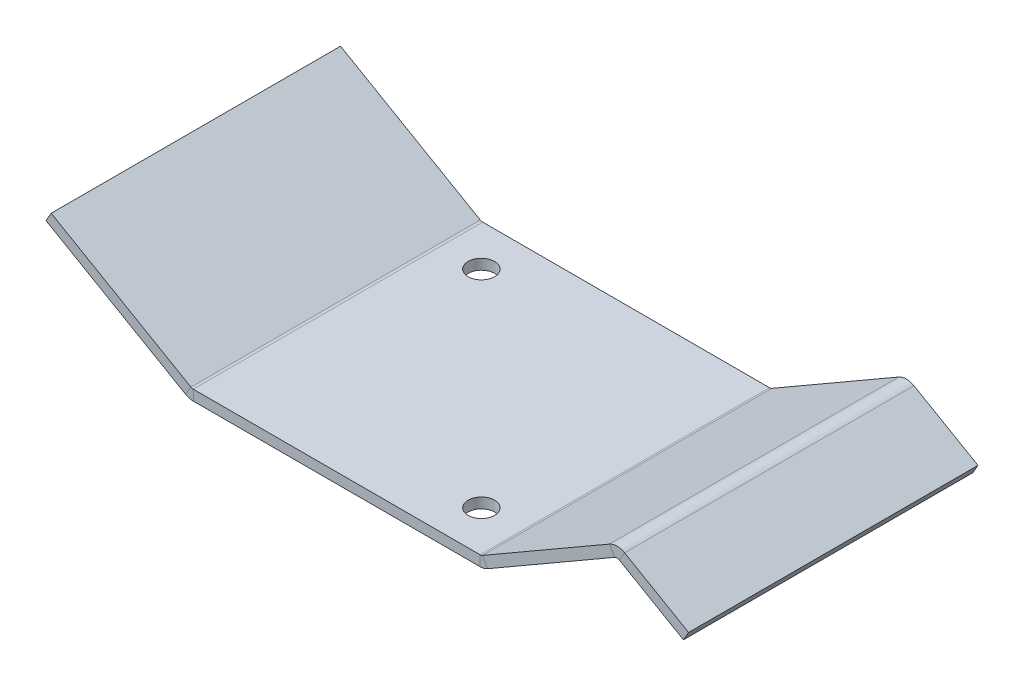
ISO-10303-21;
HEADER;
FILE_DESCRIPTION(('STEP AP214'),'2;1');
FILE_NAME('part.step','',(''),(''),'','','');
FILE_SCHEMA(('AUTOMOTIVE_DESIGN { 1 0 10303 214 1 1 1 1 }'));
ENDSEC;
DATA;
#1=APPLICATION_CONTEXT('core data for automotive mechanical design processes');
#2=APPLICATION_PROTOCOL_DEFINITION('international standard','automotive_design',2000,#1);
#3=PRODUCT_CONTEXT('',#1,'mechanical');
#4=PRODUCT('Part','Part','',(#3));
#5=PRODUCT_RELATED_PRODUCT_CATEGORY('part','',(#4));
#6=PRODUCT_DEFINITION_FORMATION('','',#4);
#7=PRODUCT_DEFINITION_CONTEXT('part definition',#1,'design');
#8=PRODUCT_DEFINITION('design','',#6,#7);
#9=PRODUCT_DEFINITION_SHAPE('','',#8);
#10=(LENGTH_UNIT() NAMED_UNIT(*) SI_UNIT(.MILLI.,.METRE.));
#11=(NAMED_UNIT(*) PLANE_ANGLE_UNIT() SI_UNIT($,.RADIAN.));
#12=(NAMED_UNIT(*) SI_UNIT($,.STERADIAN.) SOLID_ANGLE_UNIT());
#13=UNCERTAINTY_MEASURE_WITH_UNIT(LENGTH_MEASURE(1.E-05),#10,'distance_accuracy_value','');
#14=(GEOMETRIC_REPRESENTATION_CONTEXT(3) GLOBAL_UNCERTAINTY_ASSIGNED_CONTEXT((#13)) GLOBAL_UNIT_ASSIGNED_CONTEXT((#10,
#11,#12)) REPRESENTATION_CONTEXT('',''));
#15=CARTESIAN_POINT('',(0.,0.,0.));
#16=DIRECTION('',(0.,0.,1.));
#17=DIRECTION('',(1.,0.,0.));
#18=AXIS2_PLACEMENT_3D('',#15,#16,#17);
#19=CARTESIAN_POINT('',(48.41875,-1.3748153285078,-44.45));
#20=DIRECTION('',(0.,0.,1.));
#21=DIRECTION('',(1.,0.,0.));
#22=AXIS2_PLACEMENT_3D('',#19,#20,#21);
#23=PLANE('',#22);
#24=DIRECTION('',(-0.499999999999985,0.866025403784447,0.));
#25=VECTOR('',#24,1.);
#26=CARTESIAN_POINT('',(68.0916145991092,9.98331834351883,-44.45));
#27=LINE('',#26,#25);
#28=CARTESIAN_POINT('',(68.0916145991092,9.98331834351883,-44.45));
#29=VERTEX_POINT('',#28);
#30=CARTESIAN_POINT('',(67.2978645991092,11.3581336720266,-44.45));
#31=VERTEX_POINT('',#30);
#32=EDGE_CURVE('E130',#29,#31,#27,.T.);
#33=ORIENTED_EDGE('',*,*,#32,.F.);
#34=DIRECTION('',(-0.866025403784442,-0.499999999999995,0.));
#35=VECTOR('',#34,1.);
#36=CARTESIAN_POINT('',(10.3187499999997,-23.3718605846324,-44.45));
#37=LINE('',#36,#35);
#38=CARTESIAN_POINT('',(48.5896786248552,-1.27612964093542,-44.45));
#39=VERTEX_POINT('',#38);
#40=EDGE_CURVE('E417',#39,#29,#37,.F.);
#41=ORIENTED_EDGE('',*,*,#40,.F.);
#42=DIRECTION('',(-0.499999999999995,0.866025403784442,0.));
#43=VECTOR('',#42,1.);
#44=CARTESIAN_POINT('',(47.7959286248552,0.0986856875723821,-44.45));
#45=LINE('',#44,#43);
#46=CARTESIAN_POINT('',(47.7959286248552,0.0986856875723867,-44.45));
#47=VERTEX_POINT('',#46);
#48=EDGE_CURVE('E430',#47,#39,#45,.F.);
#49=ORIENTED_EDGE('',*,*,#48,.F.);
#50=DIRECTION('',(0.866025403784442,0.499999999999995,0.));
#51=VECTOR('',#50,1.);
#52=CARTESIAN_POINT('',(47.625,0.,-44.45));
#53=LINE('',#52,#51);
#54=EDGE_CURVE('E423',#47,#31,#53,.T.);
#55=ORIENTED_EDGE('',*,*,#54,.T.);
#56=EDGE_LOOP('',(#33,#41,#49,#55));
#57=FACE_BOUND('',#56,.T.);
#58=ADVANCED_FACE('F109',(#57),#23,.F.);
#59=CARTESIAN_POINT('',(70.0474145991092,11.1124999999999,0.));
#60=DIRECTION('',(0.,0.,-1.));
#61=DIRECTION('',(-1.,0.,0.));
#62=AXIS2_PLACEMENT_3D('',#59,#60,#61);
#63=PLANE('',#62);
#64=DIRECTION('',(-0.499999999999985,0.866025403784447,0.));
#65=VECTOR('',#64,1.);
#66=CARTESIAN_POINT('',(68.0916145991092,9.98331834351883,0.));
#67=LINE('',#66,#65);
#68=CARTESIAN_POINT('',(68.0916145991092,9.98331834351882,0.));
#69=VERTEX_POINT('',#68);
#70=CARTESIAN_POINT('',(67.2978645991092,11.3581336720266,0.));
#71=VERTEX_POINT('',#70);
#72=EDGE_CURVE('E321',#69,#71,#67,.T.);
#73=ORIENTED_EDGE('',*,*,#72,.T.);
#74=DIRECTION('',(-0.866025403784442,-0.499999999999995,0.));
#75=VECTOR('',#74,1.);
#76=CARTESIAN_POINT('',(69.2536645991092,12.4873153285077,0.));
#77=LINE('',#76,#75);
#78=CARTESIAN_POINT('',(47.7959286248552,0.0986856875723834,0.));
#79=VERTEX_POINT('',#78);
#80=EDGE_CURVE('E420',#71,#79,#77,.T.);
#81=ORIENTED_EDGE('',*,*,#80,.T.);
#82=DIRECTION('',(-0.499999999999995,0.866025403784442,0.));
#83=VECTOR('',#82,1.);
#84=CARTESIAN_POINT('',(48.5896786248552,-1.27612964093542,0.));
#85=LINE('',#84,#83);
#86=CARTESIAN_POINT('',(48.5896786248552,-1.27612964093542,0.));
#87=VERTEX_POINT('',#86);
#88=EDGE_CURVE('E409',#79,#87,#85,.F.);
#89=ORIENTED_EDGE('',*,*,#88,.T.);
#90=DIRECTION('',(0.866025403784442,0.499999999999995,0.));
#91=VECTOR('',#90,1.);
#92=CARTESIAN_POINT('',(10.3187499999997,-23.3718605846324,0.));
#93=LINE('',#92,#91);
#94=EDGE_CURVE('E413',#69,#87,#93,.F.);
#95=ORIENTED_EDGE('',*,*,#94,.F.);
#96=EDGE_LOOP('',(#73,#81,#89,#95));
#97=FACE_BOUND('',#96,.T.);
#98=ADVANCED_FACE('F516',(#97),#63,.F.);
#99=CARTESIAN_POINT('',(10.3187499999997,-23.3718605846324,0.));
#100=DIRECTION('',(0.499999999999995,-0.866025403784442,0.));
#101=DIRECTION('',(0.866025403784442,0.499999999999995,0.));
#102=AXIS2_PLACEMENT_3D('',#99,#100,#101);
#103=PLANE('',#102);
#104=ORIENTED_EDGE('',*,*,#40,.T.);
#105=DIRECTION('',(0.,0.,1.));
#106=VECTOR('',#105,1.);
#107=CARTESIAN_POINT('',(68.0916145991092,9.98331834351883,0.));
#108=LINE('',#107,#106);
#109=EDGE_CURVE('E140',#69,#29,#108,.F.);
#110=ORIENTED_EDGE('',*,*,#109,.F.);
#111=ORIENTED_EDGE('',*,*,#94,.T.);
#112=DIRECTION('',(0.,0.,-1.));
#113=VECTOR('',#112,1.);
#114=CARTESIAN_POINT('',(48.5896786248552,-1.27612964093542,0.));
#115=LINE('',#114,#113);
#116=EDGE_CURVE('E426',#87,#39,#115,.T.);
#117=ORIENTED_EDGE('',*,*,#116,.T.);
#118=EDGE_LOOP('',(#104,#110,#111,#117));
#119=FACE_BOUND('',#118,.T.);
#120=ADVANCED_FACE('F514',(#119),#103,.T.);
#121=CARTESIAN_POINT('',(9.52499999999971,-21.9970452561246,0.));
#122=DIRECTION('',(0.499999999999995,-0.866025403784442,0.));
#123=DIRECTION('',(0.866025403784442,0.499999999999995,0.));
#124=AXIS2_PLACEMENT_3D('',#121,#122,#123);
#125=PLANE('',#124);
#126=DIRECTION('',(0.,0.,1.));
#127=VECTOR('',#126,1.);
#128=CARTESIAN_POINT('',(67.2978645991092,11.3581336720266,0.));
#129=LINE('',#128,#127);
#130=EDGE_CURVE('E313',#71,#31,#129,.F.);
#131=ORIENTED_EDGE('',*,*,#130,.T.);
#132=ORIENTED_EDGE('',*,*,#54,.F.);
#133=DIRECTION('',(0.,0.,1.));
#134=VECTOR('',#133,1.);
#135=CARTESIAN_POINT('',(47.7959286248552,0.0986856875723851,0.));
#136=LINE('',#135,#134);
#137=EDGE_CURVE('E434',#79,#47,#136,.F.);
#138=ORIENTED_EDGE('',*,*,#137,.F.);
#139=ORIENTED_EDGE('',*,*,#80,.F.);
#140=EDGE_LOOP('',(#131,#132,#138,#139));
#141=FACE_BOUND('',#140,.T.);
#142=ADVANCED_FACE('F538',(#141),#125,.F.);
#143=CARTESIAN_POINT('',(0.,-1.5875,0.));
#144=DIRECTION('',(0.,-1.,0.));
#145=DIRECTION('',(0.,0.,-1.));
#146=AXIS2_PLACEMENT_3D('',#143,#144,#145);
#147=PLANE('',#146);
#148=CARTESIAN_POINT('',(9.525,-1.5875,-38.1));
#149=DIRECTION('',(0.,1.,0.));
#150=DIRECTION('',(0.,0.,1.));
#151=AXIS2_PLACEMENT_3D('',#148,#149,#150);
#152=CIRCLE('',#151,2.032);
#153=CARTESIAN_POINT('',(9.525,-1.5875,-36.068));
#154=VERTEX_POINT('',#153);
#155=EDGE_CURVE('E312',#154,#154,#152,.T.);
#156=ORIENTED_EDGE('',*,*,#155,.T.);
#157=EDGE_LOOP('',(#156));
#158=FACE_BOUND('',#157,.T.);
#159=CARTESIAN_POINT('',(41.275,-1.5875,-6.35));
#160=DIRECTION('',(0.,1.,0.));
#161=DIRECTION('',(0.,0.,1.));
#162=AXIS2_PLACEMENT_3D('',#159,#160,#161);
#163=CIRCLE('',#162,2.032);
#164=CARTESIAN_POINT('',(41.275,-1.5875,-4.318));
#165=VERTEX_POINT('',#164);
#166=EDGE_CURVE('E893',#165,#165,#163,.T.);
#167=ORIENTED_EDGE('',*,*,#166,.T.);
#168=EDGE_LOOP('',(#167));
#169=FACE_BOUND('',#168,.T.);
#170=DIRECTION('',(1.,0.,0.));
#171=VECTOR('',#170,1.);
#172=CARTESIAN_POINT('',(0.,-1.5875,0.));
#173=LINE('',#172,#171);
#174=CARTESIAN_POINT('',(3.3723713751448,-1.5875,0.));
#175=VERTEX_POINT('',#174);
#176=CARTESIAN_POINT('',(47.4276286248552,-1.5875,0.));
#177=VERTEX_POINT('',#176);
#178=EDGE_CURVE('E119',#175,#177,#173,.T.);
#179=ORIENTED_EDGE('',*,*,#178,.F.);
#180=DIRECTION('',(0.,0.,1.));
#181=VECTOR('',#180,1.);
#182=CARTESIAN_POINT('',(3.3723713751448,-1.5875,0.));
#183=LINE('',#182,#181);
#184=CARTESIAN_POINT('',(3.3723713751448,-1.5875,-44.45));
#185=VERTEX_POINT('',#184);
#186=EDGE_CURVE('E382',#175,#185,#183,.F.);
#187=ORIENTED_EDGE('',*,*,#186,.T.);
#188=DIRECTION('',(-1.,0.,0.));
#189=VECTOR('',#188,1.);
#190=CARTESIAN_POINT('',(0.,-1.5875,-44.45));
#191=LINE('',#190,#189);
#192=CARTESIAN_POINT('',(47.4276286248552,-1.5875,-44.45));
#193=VERTEX_POINT('',#192);
#194=EDGE_CURVE('E13',#193,#185,#191,.T.);
#195=ORIENTED_EDGE('',*,*,#194,.F.);
#196=DIRECTION('',(0.,0.,-1.));
#197=VECTOR('',#196,1.);
#198=CARTESIAN_POINT('',(47.4276286248552,-1.5875,-44.45));
#199=LINE('',#198,#197);
#200=EDGE_CURVE('E440',#193,#177,#199,.F.);
#201=ORIENTED_EDGE('',*,*,#200,.T.);
#202=EDGE_LOOP('',(#179,#187,#195,#201));
#203=FACE_BOUND('',#202,.T.);
#204=ADVANCED_FACE('F491',(#158,#169,#203),#147,.T.);
#205=CARTESIAN_POINT('',(0.,0.,0.));
#206=DIRECTION('',(0.,-1.,0.));
#207=DIRECTION('',(0.,0.,-1.));
#208=AXIS2_PLACEMENT_3D('',#205,#206,#207);
#209=PLANE('',#208);
#210=CARTESIAN_POINT('',(9.525,0.,-38.1));
#211=DIRECTION('',(0.,1.,0.));
#212=DIRECTION('',(0.,0.,1.));
#213=AXIS2_PLACEMENT_3D('',#210,#211,#212);
#214=CIRCLE('',#213,2.032);
#215=CARTESIAN_POINT('',(9.525,0.,-36.068));
#216=VERTEX_POINT('',#215);
#217=EDGE_CURVE('E885',#216,#216,#214,.T.);
#218=ORIENTED_EDGE('',*,*,#217,.F.);
#219=EDGE_LOOP('',(#218));
#220=FACE_BOUND('',#219,.T.);
#221=CARTESIAN_POINT('',(41.275,0.,-6.35));
#222=DIRECTION('',(0.,1.,0.));
#223=DIRECTION('',(0.,0.,1.));
#224=AXIS2_PLACEMENT_3D('',#221,#222,#223);
#225=CIRCLE('',#224,2.032);
#226=CARTESIAN_POINT('',(41.275,0.,-4.318));
#227=VERTEX_POINT('',#226);
#228=EDGE_CURVE('E887',#227,#227,#225,.T.);
#229=ORIENTED_EDGE('',*,*,#228,.F.);
#230=EDGE_LOOP('',(#229));
#231=FACE_BOUND('',#230,.T.);
#232=DIRECTION('',(0.,0.,1.));
#233=VECTOR('',#232,1.);
#234=CARTESIAN_POINT('',(3.3723713751448,0.,0.));
#235=LINE('',#234,#233);
#236=CARTESIAN_POINT('',(3.3723713751448,0.,0.));
#237=VERTEX_POINT('',#236);
#238=CARTESIAN_POINT('',(3.3723713751448,0.,-44.45));
#239=VERTEX_POINT('',#238);
#240=EDGE_CURVE('E399',#237,#239,#235,.F.);
#241=ORIENTED_EDGE('',*,*,#240,.F.);
#242=DIRECTION('',(1.,0.,0.));
#243=VECTOR('',#242,1.);
#244=CARTESIAN_POINT('',(0.,0.,0.));
#245=LINE('',#244,#243);
#246=CARTESIAN_POINT('',(47.4276286248552,0.,0.));
#247=VERTEX_POINT('',#246);
#248=EDGE_CURVE('E468',#237,#247,#245,.T.);
#249=ORIENTED_EDGE('',*,*,#248,.T.);
#250=DIRECTION('',(0.,0.,-1.));
#251=VECTOR('',#250,1.);
#252=CARTESIAN_POINT('',(47.4276286248552,0.,-44.45));
#253=LINE('',#252,#251);
#254=CARTESIAN_POINT('',(47.4276286248552,0.,-44.45));
#255=VERTEX_POINT('',#254);
#256=EDGE_CURVE('E457',#255,#247,#253,.F.);
#257=ORIENTED_EDGE('',*,*,#256,.F.);
#258=DIRECTION('',(-1.,0.,0.));
#259=VECTOR('',#258,1.);
#260=CARTESIAN_POINT('',(0.,0.,-44.45));
#261=LINE('',#260,#259);
#262=EDGE_CURVE('E113',#255,#239,#261,.T.);
#263=ORIENTED_EDGE('',*,*,#262,.T.);
#264=EDGE_LOOP('',(#241,#249,#257,#263));
#265=FACE_BOUND('',#264,.T.);
#266=ADVANCED_FACE('F481',(#220,#231,#265),#209,.F.);
#267=CARTESIAN_POINT('',(0.,-1.5875,0.));
#268=DIRECTION('',(0.,0.,1.));
#269=DIRECTION('',(1.,0.,0.));
#270=AXIS2_PLACEMENT_3D('',#267,#268,#269);
#271=PLANE('',#270);
#272=ORIENTED_EDGE('',*,*,#248,.F.);
#273=DIRECTION('',(0.,-1.,0.));
#274=VECTOR('',#273,1.);
#275=CARTESIAN_POINT('',(3.3723713751448,0.,0.));
#276=LINE('',#275,#274);
#277=EDGE_CURVE('E391',#237,#175,#276,.T.);
#278=ORIENTED_EDGE('',*,*,#277,.T.);
#279=ORIENTED_EDGE('',*,*,#178,.T.);
#280=DIRECTION('',(0.,-1.,0.));
#281=VECTOR('',#280,1.);
#282=CARTESIAN_POINT('',(47.4276286248552,0.,0.));
#283=LINE('',#282,#281);
#284=EDGE_CURVE('E464',#247,#177,#283,.T.);
#285=ORIENTED_EDGE('',*,*,#284,.F.);
#286=EDGE_LOOP('',(#272,#278,#279,#285));
#287=FACE_BOUND('',#286,.T.);
#288=ADVANCED_FACE('F111',(#287),#271,.T.);
#289=CARTESIAN_POINT('',(0.,-1.5875,-44.45));
#290=DIRECTION('',(0.,0.,-1.));
#291=DIRECTION('',(-1.,0.,0.));
#292=AXIS2_PLACEMENT_3D('',#289,#290,#291);
#293=PLANE('',#292);
#294=DIRECTION('',(0.,-1.,0.));
#295=VECTOR('',#294,1.);
#296=CARTESIAN_POINT('',(3.3723713751448,0.,-44.45));
#297=LINE('',#296,#295);
#298=EDGE_CURVE('E405',#239,#185,#297,.T.);
#299=ORIENTED_EDGE('',*,*,#298,.F.);
#300=ORIENTED_EDGE('',*,*,#262,.F.);
#301=DIRECTION('',(0.,-1.,0.));
#302=VECTOR('',#301,1.);
#303=CARTESIAN_POINT('',(47.4276286248552,0.,-44.45));
#304=LINE('',#303,#302);
#305=EDGE_CURVE('E449',#255,#193,#304,.T.);
#306=ORIENTED_EDGE('',*,*,#305,.T.);
#307=ORIENTED_EDGE('',*,*,#194,.T.);
#308=EDGE_LOOP('',(#299,#300,#306,#307));
#309=FACE_BOUND('',#308,.T.);
#310=ADVANCED_FACE('F484',(#309),#293,.T.);
#311=CARTESIAN_POINT('',(47.4276286248552,0.736600000000013,0.));
#312=DIRECTION('',(0.,0.,1.));
#313=DIRECTION('',(0.,-1.,0.));
#314=AXIS2_PLACEMENT_3D('',#311,#312,#313);
#315=PLANE('',#314);
#316=ORIENTED_EDGE('',*,*,#88,.F.);
#317=CARTESIAN_POINT('',(47.4276286248552,0.736600000000013,0.));
#318=DIRECTION('',(0.,0.,-1.));
#319=DIRECTION('',(0.,1.,0.));
#320=AXIS2_PLACEMENT_3D('',#317,#318,#319);
#321=CIRCLE('',#320,0.736600000000011);
#322=EDGE_CURVE('E453',#247,#79,#321,.F.);
#323=ORIENTED_EDGE('',*,*,#322,.F.);
#324=ORIENTED_EDGE('',*,*,#284,.T.);
#325=CARTESIAN_POINT('',(47.4276286248552,0.736600000000013,0.));
#326=DIRECTION('',(0.,0.,-1.));
#327=DIRECTION('',(0.,1.,0.));
#328=AXIS2_PLACEMENT_3D('',#325,#326,#327);
#329=CIRCLE('',#328,2.32410000000001);
#330=EDGE_CURVE('E444',#177,#87,#329,.F.);
#331=ORIENTED_EDGE('',*,*,#330,.T.);
#332=EDGE_LOOP('',(#316,#323,#324,#331));
#333=FACE_BOUND('',#332,.T.);
#334=ADVANCED_FACE('F505',(#333),#315,.T.);
#335=CARTESIAN_POINT('',(47.4276286248552,0.736600000000016,-44.45));
#336=DIRECTION('',(0.,0.,1.));
#337=DIRECTION('',(0.,-1.,0.));
#338=AXIS2_PLACEMENT_3D('',#335,#336,#337);
#339=PLANE('',#338);
#340=CARTESIAN_POINT('',(47.4276286248552,0.736600000000016,-44.45));
#341=DIRECTION('',(0.,0.,-1.));
#342=DIRECTION('',(0.,1.,0.));
#343=AXIS2_PLACEMENT_3D('',#340,#341,#342);
#344=CIRCLE('',#343,0.736600000000011);
#345=EDGE_CURVE('E416',#47,#255,#344,.T.);
#346=ORIENTED_EDGE('',*,*,#345,.F.);
#347=ORIENTED_EDGE('',*,*,#48,.T.);
#348=CARTESIAN_POINT('',(47.4276286248552,0.736600000000016,-44.45));
#349=DIRECTION('',(0.,0.,-1.));
#350=DIRECTION('',(0.,1.,0.));
#351=AXIS2_PLACEMENT_3D('',#348,#349,#350);
#352=CIRCLE('',#351,2.32410000000001);
#353=EDGE_CURVE('E445',#39,#193,#352,.T.);
#354=ORIENTED_EDGE('',*,*,#353,.T.);
#355=ORIENTED_EDGE('',*,*,#305,.F.);
#356=EDGE_LOOP('',(#346,#347,#354,#355));
#357=FACE_BOUND('',#356,.T.);
#358=ADVANCED_FACE('F511',(#357),#339,.F.);
#359=CARTESIAN_POINT('',(47.4276286248552,0.736600000000016,-44.45));
#360=DIRECTION('',(0.,0.,-1.));
#361=DIRECTION('',(0.499999999999995,-0.866025403784442,0.));
#362=AXIS2_PLACEMENT_3D('',#359,#360,#361);
#363=CYLINDRICAL_SURFACE('',#362,2.32410000000001);
#364=ORIENTED_EDGE('',*,*,#200,.F.);
#365=ORIENTED_EDGE('',*,*,#353,.F.);
#366=ORIENTED_EDGE('',*,*,#116,.F.);
#367=ORIENTED_EDGE('',*,*,#330,.F.);
#368=EDGE_LOOP('',(#364,#365,#366,#367));
#369=FACE_BOUND('',#368,.T.);
#370=ADVANCED_FACE('F507',(#369),#363,.T.);
#371=CARTESIAN_POINT('',(47.4276286248552,0.736600000000016,-44.45));
#372=DIRECTION('',(0.,0.,-1.));
#373=DIRECTION('',(0.499999999999995,-0.866025403784442,0.));
#374=AXIS2_PLACEMENT_3D('',#371,#372,#373);
#375=CYLINDRICAL_SURFACE('',#374,0.736600000000011);
#376=ORIENTED_EDGE('',*,*,#256,.T.);
#377=ORIENTED_EDGE('',*,*,#322,.T.);
#378=ORIENTED_EDGE('',*,*,#137,.T.);
#379=ORIENTED_EDGE('',*,*,#345,.T.);
#380=EDGE_LOOP('',(#376,#377,#378,#379));
#381=FACE_BOUND('',#380,.T.);
#382=ADVANCED_FACE('F528',(#381),#375,.F.);
#383=CARTESIAN_POINT('',(3.3723713751448,0.7366,-44.45));
#384=DIRECTION('',(0.,0.,-1.));
#385=DIRECTION('',(0.,1.,0.));
#386=AXIS2_PLACEMENT_3D('',#383,#384,#385);
#387=PLANE('',#386);
#388=DIRECTION('',(0.499999999999995,0.866025403784442,0.));
#389=VECTOR('',#388,1.);
#390=CARTESIAN_POINT('',(2.21032137514481,-1.27612964093542,-44.45));
#391=LINE('',#390,#389);
#392=CARTESIAN_POINT('',(3.0040713751448,0.0986856875723812,-44.45));
#393=VERTEX_POINT('',#392);
#394=CARTESIAN_POINT('',(2.21032137514481,-1.27612964093542,-44.45));
#395=VERTEX_POINT('',#394);
#396=EDGE_CURVE('E337',#393,#395,#391,.F.);
#397=ORIENTED_EDGE('',*,*,#396,.F.);
#398=CARTESIAN_POINT('',(3.3723713751448,0.7366,-44.45));
#399=DIRECTION('',(0.,0.,1.));
#400=DIRECTION('',(0.,-1.,0.));
#401=AXIS2_PLACEMENT_3D('',#398,#399,#400);
#402=CIRCLE('',#401,0.736599999999999);
#403=EDGE_CURVE('E395',#239,#393,#402,.F.);
#404=ORIENTED_EDGE('',*,*,#403,.F.);
#405=ORIENTED_EDGE('',*,*,#298,.T.);
#406=CARTESIAN_POINT('',(3.3723713751448,0.7366,-44.45));
#407=DIRECTION('',(0.,0.,1.));
#408=DIRECTION('',(0.,-1.,0.));
#409=AXIS2_PLACEMENT_3D('',#406,#407,#408);
#410=CIRCLE('',#409,2.3241);
#411=EDGE_CURVE('E386',#185,#395,#410,.F.);
#412=ORIENTED_EDGE('',*,*,#411,.T.);
#413=EDGE_LOOP('',(#397,#404,#405,#412));
#414=FACE_BOUND('',#413,.T.);
#415=ADVANCED_FACE('F488',(#414),#387,.T.);
#416=CARTESIAN_POINT('',(3.3723713751448,0.736600000000003,0.));
#417=DIRECTION('',(0.,0.,-1.));
#418=DIRECTION('',(0.,1.,0.));
#419=AXIS2_PLACEMENT_3D('',#416,#417,#418);
#420=PLANE('',#419);
#421=CARTESIAN_POINT('',(3.3723713751448,0.736600000000003,0.));
#422=DIRECTION('',(0.,0.,1.));
#423=DIRECTION('',(0.,-1.,0.));
#424=AXIS2_PLACEMENT_3D('',#421,#422,#423);
#425=CIRCLE('',#424,0.736599999999999);
#426=CARTESIAN_POINT('',(3.0040713751448,0.0986856875723845,0.));
#427=VERTEX_POINT('',#426);
#428=EDGE_CURVE('E344',#427,#237,#425,.T.);
#429=ORIENTED_EDGE('',*,*,#428,.F.);
#430=DIRECTION('',(0.499999999999995,0.866025403784442,0.));
#431=VECTOR('',#430,1.);
#432=CARTESIAN_POINT('',(3.0040713751448,0.0986856875723803,0.));
#433=LINE('',#432,#431);
#434=CARTESIAN_POINT('',(2.21032137514481,-1.27612964093542,0.));
#435=VERTEX_POINT('',#434);
#436=EDGE_CURVE('E372',#427,#435,#433,.F.);
#437=ORIENTED_EDGE('',*,*,#436,.T.);
#438=CARTESIAN_POINT('',(3.3723713751448,0.736600000000003,0.));
#439=DIRECTION('',(0.,0.,1.));
#440=DIRECTION('',(0.,-1.,0.));
#441=AXIS2_PLACEMENT_3D('',#438,#439,#440);
#442=CIRCLE('',#441,2.3241);
#443=EDGE_CURVE('E387',#435,#175,#442,.T.);
#444=ORIENTED_EDGE('',*,*,#443,.T.);
#445=ORIENTED_EDGE('',*,*,#277,.F.);
#446=EDGE_LOOP('',(#429,#437,#444,#445));
#447=FACE_BOUND('',#446,.T.);
#448=ADVANCED_FACE('F496',(#447),#420,.F.);
#449=CARTESIAN_POINT('',(3.3723713751448,0.736600000000003,0.));
#450=DIRECTION('',(0.,0.,1.));
#451=DIRECTION('',(-0.499999999999995,-0.866025403784442,0.));
#452=AXIS2_PLACEMENT_3D('',#449,#450,#451);
#453=CYLINDRICAL_SURFACE('',#452,2.3241);
#454=ORIENTED_EDGE('',*,*,#186,.F.);
#455=ORIENTED_EDGE('',*,*,#443,.F.);
#456=DIRECTION('',(0.,0.,1.));
#457=VECTOR('',#456,1.);
#458=CARTESIAN_POINT('',(2.21032137514481,-1.27612964093542,-44.45));
#459=LINE('',#458,#457);
#460=EDGE_CURVE('E369',#435,#395,#459,.F.);
#461=ORIENTED_EDGE('',*,*,#460,.T.);
#462=ORIENTED_EDGE('',*,*,#411,.F.);
#463=EDGE_LOOP('',(#454,#455,#461,#462));
#464=FACE_BOUND('',#463,.T.);
#465=ADVANCED_FACE('F493',(#464),#453,.T.);
#466=CARTESIAN_POINT('',(3.3723713751448,0.736600000000003,0.));
#467=DIRECTION('',(0.,0.,1.));
#468=DIRECTION('',(-0.499999999999995,-0.866025403784442,0.));
#469=AXIS2_PLACEMENT_3D('',#466,#467,#468);
#470=CYLINDRICAL_SURFACE('',#469,0.736599999999999);
#471=ORIENTED_EDGE('',*,*,#240,.T.);
#472=ORIENTED_EDGE('',*,*,#403,.T.);
#473=DIRECTION('',(0.,0.,1.));
#474=VECTOR('',#473,1.);
#475=CARTESIAN_POINT('',(3.0040713751448,0.0986856875723818,-44.45));
#476=LINE('',#475,#474);
#477=EDGE_CURVE('E376',#393,#427,#476,.T.);
#478=ORIENTED_EDGE('',*,*,#477,.T.);
#479=ORIENTED_EDGE('',*,*,#428,.T.);
#480=EDGE_LOOP('',(#471,#472,#478,#479));
#481=FACE_BOUND('',#480,.T.);
#482=ADVANCED_FACE('F579',(#481),#470,.F.);
#483=CARTESIAN_POINT('',(-19.2474145991092,11.1124999999999,0.));
#484=DIRECTION('',(0.,0.,-1.));
#485=DIRECTION('',(-1.,0.,0.));
#486=AXIS2_PLACEMENT_3D('',#483,#484,#485);
#487=PLANE('',#486);
#488=ORIENTED_EDGE('',*,*,#436,.F.);
#489=DIRECTION('',(0.866025403784442,-0.499999999999995,0.));
#490=VECTOR('',#489,1.);
#491=CARTESIAN_POINT('',(-18.4536645991092,12.4873153285077,0.));
#492=LINE('',#491,#490);
#493=CARTESIAN_POINT('',(-18.4536645991092,12.4873153285077,0.));
#494=VERTEX_POINT('',#493);
#495=EDGE_CURVE('E366',#427,#494,#492,.F.);
#496=ORIENTED_EDGE('',*,*,#495,.T.);
#497=DIRECTION('',(0.499999999999995,0.866025403784442,0.));
#498=VECTOR('',#497,1.);
#499=CARTESIAN_POINT('',(-19.2474145991092,11.1124999999999,0.));
#500=LINE('',#499,#498);
#501=CARTESIAN_POINT('',(-19.2474145991092,11.1124999999999,0.));
#502=VERTEX_POINT('',#501);
#503=EDGE_CURVE('E340',#502,#494,#500,.T.);
#504=ORIENTED_EDGE('',*,*,#503,.F.);
#505=DIRECTION('',(-0.866025403784442,0.499999999999995,0.));
#506=VECTOR('',#505,1.);
#507=CARTESIAN_POINT('',(2.38125000000004,-1.3748153285078,0.));
#508=LINE('',#507,#506);
#509=EDGE_CURVE('E356',#435,#502,#508,.T.);
#510=ORIENTED_EDGE('',*,*,#509,.F.);
#511=EDGE_LOOP('',(#488,#496,#504,#510));
#512=FACE_BOUND('',#511,.T.);
#513=ADVANCED_FACE('F587',(#512),#487,.F.);
#514=CARTESIAN_POINT('',(2.38125000000004,-1.3748153285078,-44.45));
#515=DIRECTION('',(0.,0.,1.));
#516=DIRECTION('',(1.,0.,0.));
#517=AXIS2_PLACEMENT_3D('',#514,#515,#516);
#518=PLANE('',#517);
#519=ORIENTED_EDGE('',*,*,#396,.T.);
#520=DIRECTION('',(0.866025403784442,-0.499999999999995,0.));
#521=VECTOR('',#520,1.);
#522=CARTESIAN_POINT('',(2.38125000000004,-1.3748153285078,-44.45));
#523=LINE('',#522,#521);
#524=CARTESIAN_POINT('',(-19.2474145991092,11.1124999999999,-44.45));
#525=VERTEX_POINT('',#524);
#526=EDGE_CURVE('E349',#525,#395,#523,.T.);
#527=ORIENTED_EDGE('',*,*,#526,.F.);
#528=DIRECTION('',(0.499999999999995,0.866025403784442,0.));
#529=VECTOR('',#528,1.);
#530=CARTESIAN_POINT('',(-19.2474145991092,11.1124999999999,-44.45));
#531=LINE('',#530,#529);
#532=CARTESIAN_POINT('',(-18.4536645991092,12.4873153285077,-44.45));
#533=VERTEX_POINT('',#532);
#534=EDGE_CURVE('E345',#525,#533,#531,.T.);
#535=ORIENTED_EDGE('',*,*,#534,.T.);
#536=DIRECTION('',(-0.866025403784442,0.499999999999995,0.));
#537=VECTOR('',#536,1.);
#538=CARTESIAN_POINT('',(3.17500000000003,0.,-44.45));
#539=LINE('',#538,#537);
#540=EDGE_CURVE('E359',#533,#393,#539,.F.);
#541=ORIENTED_EDGE('',*,*,#540,.T.);
#542=EDGE_LOOP('',(#519,#527,#535,#541));
#543=FACE_BOUND('',#542,.T.);
#544=ADVANCED_FACE('F596',(#543),#518,.F.);
#545=CARTESIAN_POINT('',(2.38125000000004,-1.3748153285078,0.));
#546=DIRECTION('',(0.499999999999995,0.866025403784442,0.));
#547=DIRECTION('',(-0.866025403784442,0.499999999999995,0.));
#548=AXIS2_PLACEMENT_3D('',#545,#546,#547);
#549=PLANE('',#548);
#550=ORIENTED_EDGE('',*,*,#460,.F.);
#551=ORIENTED_EDGE('',*,*,#509,.T.);
#552=DIRECTION('',(0.,0.,-1.));
#553=VECTOR('',#552,1.);
#554=CARTESIAN_POINT('',(-19.2474145991092,11.1124999999999,0.));
#555=LINE('',#554,#553);
#556=EDGE_CURVE('E353',#502,#525,#555,.T.);
#557=ORIENTED_EDGE('',*,*,#556,.T.);
#558=ORIENTED_EDGE('',*,*,#526,.T.);
#559=EDGE_LOOP('',(#550,#551,#557,#558));
#560=FACE_BOUND('',#559,.T.);
#561=ADVANCED_FACE('F605',(#560),#549,.F.);
#562=CARTESIAN_POINT('',(3.17500000000003,0.,0.));
#563=DIRECTION('',(0.499999999999995,0.866025403784442,0.));
#564=DIRECTION('',(-0.866025403784442,0.499999999999995,0.));
#565=AXIS2_PLACEMENT_3D('',#562,#563,#564);
#566=PLANE('',#565);
#567=ORIENTED_EDGE('',*,*,#495,.F.);
#568=ORIENTED_EDGE('',*,*,#477,.F.);
#569=ORIENTED_EDGE('',*,*,#540,.F.);
#570=DIRECTION('',(0.,0.,1.));
#571=VECTOR('',#570,1.);
#572=CARTESIAN_POINT('',(-18.4536645991092,12.4873153285077,-44.45));
#573=LINE('',#572,#571);
#574=EDGE_CURVE('E363',#494,#533,#573,.F.);
#575=ORIENTED_EDGE('',*,*,#574,.F.);
#576=EDGE_LOOP('',(#567,#568,#569,#575));
#577=FACE_BOUND('',#576,.T.);
#578=ADVANCED_FACE('F615',(#577),#566,.T.);
#579=CARTESIAN_POINT('',(-19.2474145991092,11.1124999999999,-44.45));
#580=DIRECTION('',(0.866025403784442,-0.499999999999995,0.));
#581=DIRECTION('',(0.499999999999995,0.866025403784442,0.));
#582=AXIS2_PLACEMENT_3D('',#579,#580,#581);
#583=PLANE('',#582);
#584=ORIENTED_EDGE('',*,*,#574,.T.);
#585=ORIENTED_EDGE('',*,*,#534,.F.);
#586=ORIENTED_EDGE('',*,*,#556,.F.);
#587=ORIENTED_EDGE('',*,*,#503,.T.);
#588=EDGE_LOOP('',(#584,#585,#586,#587));
#589=FACE_BOUND('',#588,.T.);
#590=ADVANCED_FACE('F624',(#589),#583,.F.);
#591=CARTESIAN_POINT('',(68.4599145991092,9.34540403109121,-44.45));
#592=DIRECTION('',(0.,0.,-1.));
#593=DIRECTION('',(-1.,0.,0.));
#594=AXIS2_PLACEMENT_3D('',#591,#592,#593);
#595=PLANE('',#594);
#596=DIRECTION('',(-0.500000000000001,-0.866025403784438,0.));
#597=VECTOR('',#596,1.);
#598=CARTESIAN_POINT('',(69.6219645991092,11.3581336720266,-44.45));
#599=LINE('',#598,#597);
#600=CARTESIAN_POINT('',(68.8282145991092,9.98331834351882,-44.45));
#601=VERTEX_POINT('',#600);
#602=CARTESIAN_POINT('',(69.6219645991092,11.3581336720266,-44.45));
#603=VERTEX_POINT('',#602);
#604=EDGE_CURVE('E285',#601,#603,#599,.F.);
#605=ORIENTED_EDGE('',*,*,#604,.F.);
#606=CARTESIAN_POINT('',(68.4599145991092,9.34540403109121,-44.45));
#607=DIRECTION('',(0.,0.,1.));
#608=DIRECTION('',(1.,0.,0.));
#609=AXIS2_PLACEMENT_3D('',#606,#607,#608);
#610=CIRCLE('',#609,0.736599999999999);
#611=EDGE_CURVE('E325',#29,#601,#610,.F.);
#612=ORIENTED_EDGE('',*,*,#611,.F.);
#613=ORIENTED_EDGE('',*,*,#32,.T.);
#614=CARTESIAN_POINT('',(68.4599145991092,9.34540403109121,-44.45));
#615=DIRECTION('',(0.,0.,1.));
#616=DIRECTION('',(1.,0.,0.));
#617=AXIS2_PLACEMENT_3D('',#614,#615,#616);
#618=CIRCLE('',#617,2.3241);
#619=EDGE_CURVE('E316',#31,#603,#618,.F.);
#620=ORIENTED_EDGE('',*,*,#619,.T.);
#621=EDGE_LOOP('',(#605,#612,#613,#620));
#622=FACE_BOUND('',#621,.T.);
#623=ADVANCED_FACE('F632',(#622),#595,.T.);
#624=CARTESIAN_POINT('',(68.4599145991092,9.34540403109121,0.));
#625=DIRECTION('',(0.,0.,-1.));
#626=DIRECTION('',(-1.,0.,0.));
#627=AXIS2_PLACEMENT_3D('',#624,#625,#626);
#628=PLANE('',#627);
#629=CARTESIAN_POINT('',(68.4599145991092,9.34540403109121,0.));
#630=DIRECTION('',(0.,0.,1.));
#631=DIRECTION('',(1.,0.,0.));
#632=AXIS2_PLACEMENT_3D('',#629,#630,#631);
#633=CIRCLE('',#632,0.736599999999999);
#634=CARTESIAN_POINT('',(68.8282145991092,9.98331834351882,0.));
#635=VERTEX_POINT('',#634);
#636=EDGE_CURVE('E331',#635,#69,#633,.T.);
#637=ORIENTED_EDGE('',*,*,#636,.F.);
#638=DIRECTION('',(-0.500000000000001,-0.866025403784438,0.));
#639=VECTOR('',#638,1.);
#640=CARTESIAN_POINT('',(68.8282145991092,9.9833183435188,0.));
#641=LINE('',#640,#639);
#642=CARTESIAN_POINT('',(69.6219645991092,11.3581336720266,0.));
#643=VERTEX_POINT('',#642);
#644=EDGE_CURVE('E303',#635,#643,#641,.F.);
#645=ORIENTED_EDGE('',*,*,#644,.T.);
#646=CARTESIAN_POINT('',(68.4599145991092,9.34540403109121,0.));
#647=DIRECTION('',(0.,0.,1.));
#648=DIRECTION('',(1.,0.,0.));
#649=AXIS2_PLACEMENT_3D('',#646,#647,#648);
#650=CIRCLE('',#649,2.3241);
#651=EDGE_CURVE('E317',#643,#71,#650,.T.);
#652=ORIENTED_EDGE('',*,*,#651,.T.);
#653=ORIENTED_EDGE('',*,*,#72,.F.);
#654=EDGE_LOOP('',(#637,#645,#652,#653));
#655=FACE_BOUND('',#654,.T.);
#656=ADVANCED_FACE('F673',(#655),#628,.F.);
#657=CARTESIAN_POINT('',(68.4599145991092,9.34540403109121,0.));
#658=DIRECTION('',(0.,0.,1.));
#659=DIRECTION('',(0.500000000000001,0.866025403784438,0.));
#660=AXIS2_PLACEMENT_3D('',#657,#658,#659);
#661=CYLINDRICAL_SURFACE('',#660,2.3241);
#662=ORIENTED_EDGE('',*,*,#130,.F.);
#663=ORIENTED_EDGE('',*,*,#651,.F.);
#664=DIRECTION('',(0.,0.,1.));
#665=VECTOR('',#664,1.);
#666=CARTESIAN_POINT('',(69.6219645991092,11.3581336720266,-44.45));
#667=LINE('',#666,#665);
#668=EDGE_CURVE('E300',#643,#603,#667,.F.);
#669=ORIENTED_EDGE('',*,*,#668,.T.);
#670=ORIENTED_EDGE('',*,*,#619,.F.);
#671=EDGE_LOOP('',(#662,#663,#669,#670));
#672=FACE_BOUND('',#671,.T.);
#673=ADVANCED_FACE('F685',(#672),#661,.T.);
#674=CARTESIAN_POINT('',(68.4599145991092,9.34540403109121,0.));
#675=DIRECTION('',(0.,0.,1.));
#676=DIRECTION('',(0.500000000000001,0.866025403784438,0.));
#677=AXIS2_PLACEMENT_3D('',#674,#675,#676);
#678=CYLINDRICAL_SURFACE('',#677,0.736599999999999);
#679=ORIENTED_EDGE('',*,*,#109,.T.);
#680=ORIENTED_EDGE('',*,*,#611,.T.);
#681=DIRECTION('',(0.,0.,1.));
#682=VECTOR('',#681,1.);
#683=CARTESIAN_POINT('',(68.8282145991092,9.98331834351882,-44.45));
#684=LINE('',#683,#682);
#685=EDGE_CURVE('E307',#601,#635,#684,.T.);
#686=ORIENTED_EDGE('',*,*,#685,.T.);
#687=ORIENTED_EDGE('',*,*,#636,.T.);
#688=EDGE_LOOP('',(#679,#680,#686,#687));
#689=FACE_BOUND('',#688,.T.);
#690=ADVANCED_FACE('F697',(#689),#678,.F.);
#691=CARTESIAN_POINT('',(79.4584372271716,5.67904355233839,0.));
#692=DIRECTION('',(0.,0.,-1.));
#693=DIRECTION('',(-1.,0.,0.));
#694=AXIS2_PLACEMENT_3D('',#691,#692,#693);
#695=PLANE('',#694);
#696=ORIENTED_EDGE('',*,*,#644,.F.);
#697=DIRECTION('',(-0.866025403784438,0.500000000000001,0.));
#698=VECTOR('',#697,1.);
#699=CARTESIAN_POINT('',(78.6646872271716,4.30422822383061,0.));
#700=LINE('',#699,#698);
#701=CARTESIAN_POINT('',(78.6646872271716,4.30422822383061,0.));
#702=VERTEX_POINT('',#701);
#703=EDGE_CURVE('E297',#635,#702,#700,.F.);
#704=ORIENTED_EDGE('',*,*,#703,.T.);
#705=DIRECTION('',(-0.500000000000001,-0.866025403784438,0.));
#706=VECTOR('',#705,1.);
#707=CARTESIAN_POINT('',(79.4584372271716,5.67904355233839,0.));
#708=LINE('',#707,#706);
#709=CARTESIAN_POINT('',(79.4584372271716,5.6790435523384,0.));
#710=VERTEX_POINT('',#709);
#711=EDGE_CURVE('E281',#710,#702,#708,.T.);
#712=ORIENTED_EDGE('',*,*,#711,.F.);
#713=DIRECTION('',(0.866025403784438,-0.500000000000001,0.));
#714=VECTOR('',#713,1.);
#715=CARTESIAN_POINT('',(21.5299572995546,39.124067032294,0.));
#716=LINE('',#715,#714);
#717=EDGE_CURVE('E266',#643,#710,#716,.T.);
#718=ORIENTED_EDGE('',*,*,#717,.F.);
#719=EDGE_LOOP('',(#696,#704,#712,#718));
#720=FACE_BOUND('',#719,.T.);
#721=ADVANCED_FACE('F708',(#720),#695,.F.);
#722=CARTESIAN_POINT('',(69.2536645991092,11.5707717761691,-44.45));
#723=DIRECTION('',(0.,0.,1.));
#724=DIRECTION('',(0.,-1.,0.));
#725=AXIS2_PLACEMENT_3D('',#722,#723,#724);
#726=PLANE('',#725);
#727=ORIENTED_EDGE('',*,*,#604,.T.);
#728=DIRECTION('',(-0.866025403784438,0.500000000000001,0.));
#729=VECTOR('',#728,1.);
#730=CARTESIAN_POINT('',(21.5299572995546,39.124067032294,-44.45));
#731=LINE('',#730,#729);
#732=CARTESIAN_POINT('',(79.4584372271716,5.67904355233841,-44.45));
#733=VERTEX_POINT('',#732);
#734=EDGE_CURVE('E264',#733,#603,#731,.T.);
#735=ORIENTED_EDGE('',*,*,#734,.F.);
#736=DIRECTION('',(-0.500000000000001,-0.866025403784438,0.));
#737=VECTOR('',#736,1.);
#738=CARTESIAN_POINT('',(79.4584372271716,5.67904355233839,-44.45));
#739=LINE('',#738,#737);
#740=CARTESIAN_POINT('',(78.6646872271716,4.30422822383061,-44.45));
#741=VERTEX_POINT('',#740);
#742=EDGE_CURVE('E273',#733,#741,#739,.T.);
#743=ORIENTED_EDGE('',*,*,#742,.T.);
#744=DIRECTION('',(0.866025403784438,-0.500000000000001,0.));
#745=VECTOR('',#744,1.);
#746=CARTESIAN_POINT('',(68.4599145991092,10.1959564476614,-44.45));
#747=LINE('',#746,#745);
#748=EDGE_CURVE('E293',#741,#601,#747,.F.);
#749=ORIENTED_EDGE('',*,*,#748,.T.);
#750=EDGE_LOOP('',(#727,#735,#743,#749));
#751=FACE_BOUND('',#750,.T.);
#752=ADVANCED_FACE('F284',(#751),#726,.F.);
#753=CARTESIAN_POINT('',(21.5299572995546,39.124067032294,0.));
#754=DIRECTION('',(-0.500000000000001,-0.866025403784438,0.));
#755=DIRECTION('',(0.866025403784438,-0.500000000000001,0.));
#756=AXIS2_PLACEMENT_3D('',#753,#754,#755);
#757=PLANE('',#756);
#758=ORIENTED_EDGE('',*,*,#668,.F.);
#759=ORIENTED_EDGE('',*,*,#717,.T.);
#760=DIRECTION('',(0.,0.,-1.));
#761=VECTOR('',#760,1.);
#762=CARTESIAN_POINT('',(79.4584372271716,5.6790435523384,0.));
#763=LINE('',#762,#761);
#764=EDGE_CURVE('E259',#710,#733,#763,.T.);
#765=ORIENTED_EDGE('',*,*,#764,.T.);
#766=ORIENTED_EDGE('',*,*,#734,.T.);
#767=EDGE_LOOP('',(#758,#759,#765,#766));
#768=FACE_BOUND('',#767,.T.);
#769=ADVANCED_FACE('F262',(#768),#757,.F.);
#770=CARTESIAN_POINT('',(20.7362072995546,37.7492517037862,0.));
#771=DIRECTION('',(-0.500000000000001,-0.866025403784438,0.));
#772=DIRECTION('',(0.866025403784438,-0.500000000000001,0.));
#773=AXIS2_PLACEMENT_3D('',#770,#771,#772);
#774=PLANE('',#773);
#775=ORIENTED_EDGE('',*,*,#703,.F.);
#776=ORIENTED_EDGE('',*,*,#685,.F.);
#777=ORIENTED_EDGE('',*,*,#748,.F.);
#778=DIRECTION('',(0.,0.,1.));
#779=VECTOR('',#778,1.);
#780=CARTESIAN_POINT('',(78.6646872271716,4.30422822383061,-44.45));
#781=LINE('',#780,#779);
#782=EDGE_CURVE('E276',#702,#741,#781,.F.);
#783=ORIENTED_EDGE('',*,*,#782,.F.);
#784=EDGE_LOOP('',(#775,#776,#777,#783));
#785=FACE_BOUND('',#784,.T.);
#786=ADVANCED_FACE('F738',(#785),#774,.T.);
#787=CARTESIAN_POINT('',(79.4584372271716,5.67904355233839,-44.45));
#788=DIRECTION('',(-0.866025403784438,0.500000000000001,0.));
#789=DIRECTION('',(-0.500000000000001,-0.866025403784438,0.));
#790=AXIS2_PLACEMENT_3D('',#787,#788,#789);
#791=PLANE('',#790);
#792=ORIENTED_EDGE('',*,*,#782,.T.);
#793=ORIENTED_EDGE('',*,*,#742,.F.);
#794=ORIENTED_EDGE('',*,*,#764,.F.);
#795=ORIENTED_EDGE('',*,*,#711,.T.);
#796=EDGE_LOOP('',(#792,#793,#794,#795));
#797=FACE_BOUND('',#796,.T.);
#798=ADVANCED_FACE('F274',(#797),#791,.F.);
#799=CARTESIAN_POINT('',(41.275,-1.5875,-6.35));
#800=DIRECTION('',(0.,1.,0.));
#801=DIRECTION('',(0.,0.,1.));
#802=AXIS2_PLACEMENT_3D('',#799,#800,#801);
#803=CYLINDRICAL_SURFACE('',#802,2.032);
#804=ORIENTED_EDGE('',*,*,#166,.F.);
#805=EDGE_LOOP('',(#804));
#806=FACE_BOUND('',#805,.T.);
#807=ORIENTED_EDGE('',*,*,#228,.T.);
#808=EDGE_LOOP('',(#807));
#809=FACE_BOUND('',#808,.T.);
#810=ADVANCED_FACE('F759',(#806,#809),#803,.F.);
#811=CARTESIAN_POINT('',(9.525,-1.5875,-38.1));
#812=DIRECTION('',(0.,1.,0.));
#813=DIRECTION('',(0.,0.,1.));
#814=AXIS2_PLACEMENT_3D('',#811,#812,#813);
#815=CYLINDRICAL_SURFACE('',#814,2.032);
#816=ORIENTED_EDGE('',*,*,#155,.F.);
#817=EDGE_LOOP('',(#816));
#818=FACE_BOUND('',#817,.T.);
#819=ORIENTED_EDGE('',*,*,#217,.T.);
#820=EDGE_LOOP('',(#819));
#821=FACE_BOUND('',#820,.T.);
#822=ADVANCED_FACE('F770',(#818,#821),#815,.F.);
#823=CLOSED_SHELL('',(#58,#98,#120,#142,#204,#266,#288,#310,#334,#358,#370,#382,#415,#448,#465,
#482,#513,#544,#561,#578,#590,#623,#656,#673,#690,#721,#752,#769,#786,#798,#810,#822));
#824=MANIFOLD_SOLID_BREP('B2',#823);
#825=ADVANCED_BREP_SHAPE_REPRESENTATION('',(#18,#824),#14);
#826=SHAPE_DEFINITION_REPRESENTATION(#9,#825);
ENDSEC;
END-ISO-10303-21;
